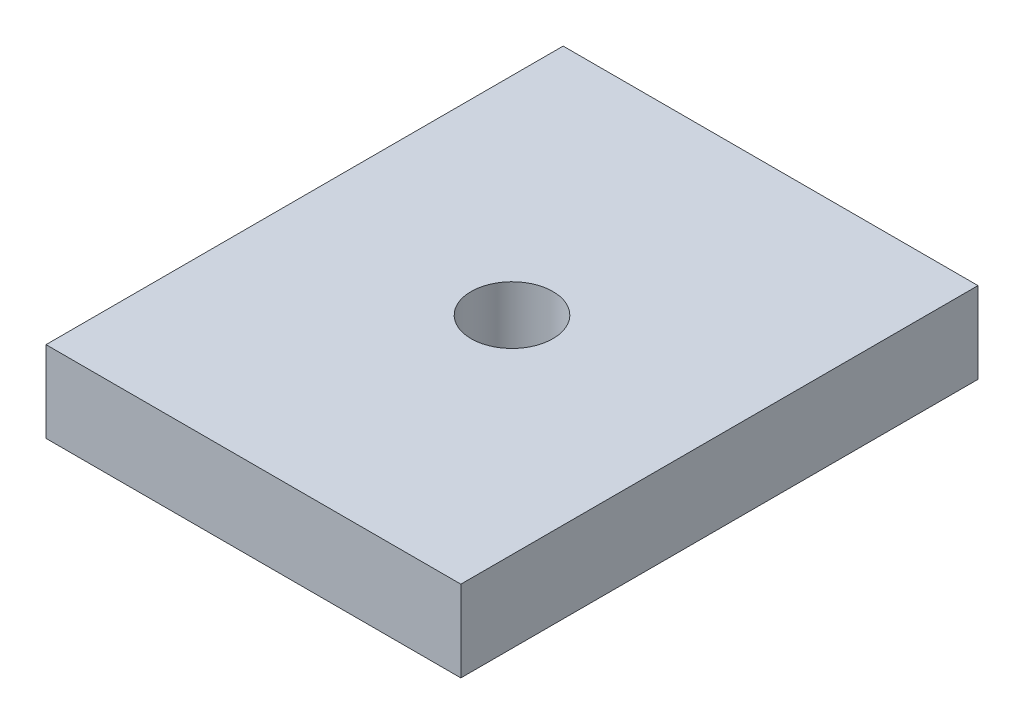
ISO-10303-21;
HEADER;
FILE_DESCRIPTION(('STEP AP214'),'2;1');
FILE_NAME('part.step','',(''),(''),'','','');
FILE_SCHEMA(('AUTOMOTIVE_DESIGN { 1 0 10303 214 1 1 1 1 }'));
ENDSEC;
DATA;
#1=APPLICATION_CONTEXT('core data for automotive mechanical design processes');
#2=APPLICATION_PROTOCOL_DEFINITION('international standard','automotive_design',2000,#1);
#3=PRODUCT_CONTEXT('',#1,'mechanical');
#4=PRODUCT('Part','Part','',(#3));
#5=PRODUCT_RELATED_PRODUCT_CATEGORY('part','',(#4));
#6=PRODUCT_DEFINITION_FORMATION('','',#4);
#7=PRODUCT_DEFINITION_CONTEXT('part definition',#1,'design');
#8=PRODUCT_DEFINITION('design','',#6,#7);
#9=PRODUCT_DEFINITION_SHAPE('','',#8);
#10=(LENGTH_UNIT() NAMED_UNIT(*) SI_UNIT(.MILLI.,.METRE.));
#11=(NAMED_UNIT(*) PLANE_ANGLE_UNIT() SI_UNIT($,.RADIAN.));
#12=(NAMED_UNIT(*) SI_UNIT($,.STERADIAN.) SOLID_ANGLE_UNIT());
#13=UNCERTAINTY_MEASURE_WITH_UNIT(LENGTH_MEASURE(1.E-05),#10,'distance_accuracy_value','');
#14=(GEOMETRIC_REPRESENTATION_CONTEXT(3) GLOBAL_UNCERTAINTY_ASSIGNED_CONTEXT((#13)) GLOBAL_UNIT_ASSIGNED_CONTEXT((#10,
#11,#12)) REPRESENTATION_CONTEXT('',''));
#15=CARTESIAN_POINT('',(0.,0.,0.));
#16=DIRECTION('',(0.,0.,1.));
#17=DIRECTION('',(1.,0.,0.));
#18=AXIS2_PLACEMENT_3D('',#15,#16,#17);
#19=CARTESIAN_POINT('',(25.537929701986,10.,31.8349129242961));
#20=DIRECTION('',(-1.,0.,0.));
#21=DIRECTION('',(0.,0.,1.));
#22=AXIS2_PLACEMENT_3D('',#19,#20,#21);
#23=PLANE('',#22);
#24=DIRECTION('',(0.,0.,-1.));
#25=VECTOR('',#24,1.);
#26=CARTESIAN_POINT('',(25.537929701986,0.,31.8349129242961));
#27=LINE('',#26,#25);
#28=CARTESIAN_POINT('',(25.537929701986,0.,31.8349129242961));
#29=VERTEX_POINT('',#28);
#30=CARTESIAN_POINT('',(25.537929701986,0.,-31.8349129242961));
#31=VERTEX_POINT('',#30);
#32=EDGE_CURVE('E102',#29,#31,#27,.T.);
#33=ORIENTED_EDGE('',*,*,#32,.T.);
#34=DIRECTION('',(0.,-1.,0.));
#35=VECTOR('',#34,1.);
#36=CARTESIAN_POINT('',(25.537929701986,10.,-31.8349129242961));
#37=LINE('',#36,#35);
#38=CARTESIAN_POINT('',(25.537929701986,10.,-31.8349129242961));
#39=VERTEX_POINT('',#38);
#40=EDGE_CURVE('E11',#39,#31,#37,.T.);
#41=ORIENTED_EDGE('',*,*,#40,.F.);
#42=DIRECTION('',(0.,0.,-1.));
#43=VECTOR('',#42,1.);
#44=CARTESIAN_POINT('',(25.537929701986,10.,31.8349129242961));
#45=LINE('',#44,#43);
#46=CARTESIAN_POINT('',(25.537929701986,10.,31.8349129242961));
#47=VERTEX_POINT('',#46);
#48=EDGE_CURVE('E90',#47,#39,#45,.T.);
#49=ORIENTED_EDGE('',*,*,#48,.F.);
#50=DIRECTION('',(0.,-1.,0.));
#51=VECTOR('',#50,1.);
#52=CARTESIAN_POINT('',(25.537929701986,10.,31.8349129242961));
#53=LINE('',#52,#51);
#54=EDGE_CURVE('E98',#47,#29,#53,.T.);
#55=ORIENTED_EDGE('',*,*,#54,.T.);
#56=EDGE_LOOP('',(#33,#41,#49,#55));
#57=FACE_BOUND('',#56,.T.);
#58=ADVANCED_FACE('F39',(#57),#23,.F.);
#59=CARTESIAN_POINT('',(-25.537929701986,10.,-31.8349129242961));
#60=DIRECTION('',(0.,0.,1.));
#61=DIRECTION('',(1.,0.,0.));
#62=AXIS2_PLACEMENT_3D('',#59,#60,#61);
#63=PLANE('',#62);
#64=DIRECTION('',(-1.,0.,0.));
#65=VECTOR('',#64,1.);
#66=CARTESIAN_POINT('',(-25.537929701986,0.,-31.8349129242961));
#67=LINE('',#66,#65);
#68=CARTESIAN_POINT('',(-25.537929701986,0.,-31.8349129242961));
#69=VERTEX_POINT('',#68);
#70=EDGE_CURVE('E94',#31,#69,#67,.T.);
#71=ORIENTED_EDGE('',*,*,#70,.T.);
#72=DIRECTION('',(0.,-1.,0.));
#73=VECTOR('',#72,1.);
#74=CARTESIAN_POINT('',(-25.537929701986,10.,-31.8349129242961));
#75=LINE('',#74,#73);
#76=CARTESIAN_POINT('',(-25.537929701986,10.,-31.8349129242961));
#77=VERTEX_POINT('',#76);
#78=EDGE_CURVE('E47',#77,#69,#75,.T.);
#79=ORIENTED_EDGE('',*,*,#78,.F.);
#80=DIRECTION('',(-1.,0.,0.));
#81=VECTOR('',#80,1.);
#82=CARTESIAN_POINT('',(-25.537929701986,10.,-31.8349129242961));
#83=LINE('',#82,#81);
#84=EDGE_CURVE('E85',#39,#77,#83,.T.);
#85=ORIENTED_EDGE('',*,*,#84,.F.);
#86=ORIENTED_EDGE('',*,*,#40,.T.);
#87=EDGE_LOOP('',(#71,#79,#85,#86));
#88=FACE_BOUND('',#87,.T.);
#89=ADVANCED_FACE('F93',(#88),#63,.F.);
#90=CARTESIAN_POINT('',(-25.537929701986,10.,31.8349129242961));
#91=DIRECTION('',(1.,0.,0.));
#92=DIRECTION('',(0.,0.,-1.));
#93=AXIS2_PLACEMENT_3D('',#90,#91,#92);
#94=PLANE('',#93);
#95=DIRECTION('',(0.,0.,1.));
#96=VECTOR('',#95,1.);
#97=CARTESIAN_POINT('',(-25.537929701986,0.,31.8349129242961));
#98=LINE('',#97,#96);
#99=CARTESIAN_POINT('',(-25.537929701986,0.,31.8349129242961));
#100=VERTEX_POINT('',#99);
#101=EDGE_CURVE('E72',#69,#100,#98,.T.);
#102=ORIENTED_EDGE('',*,*,#101,.T.);
#103=DIRECTION('',(0.,-1.,0.));
#104=VECTOR('',#103,1.);
#105=CARTESIAN_POINT('',(-25.537929701986,10.,31.8349129242961));
#106=LINE('',#105,#104);
#107=CARTESIAN_POINT('',(-25.537929701986,10.,31.8349129242961));
#108=VERTEX_POINT('',#107);
#109=EDGE_CURVE('E95',#108,#100,#106,.T.);
#110=ORIENTED_EDGE('',*,*,#109,.F.);
#111=DIRECTION('',(0.,0.,1.));
#112=VECTOR('',#111,1.);
#113=CARTESIAN_POINT('',(-25.537929701986,10.,31.8349129242961));
#114=LINE('',#113,#112);
#115=EDGE_CURVE('E88',#77,#108,#114,.T.);
#116=ORIENTED_EDGE('',*,*,#115,.F.);
#117=ORIENTED_EDGE('',*,*,#78,.T.);
#118=EDGE_LOOP('',(#102,#110,#116,#117));
#119=FACE_BOUND('',#118,.T.);
#120=ADVANCED_FACE('F96',(#119),#94,.F.);
#121=CARTESIAN_POINT('',(-25.537929701986,10.,31.8349129242961));
#122=DIRECTION('',(0.,0.,-1.));
#123=DIRECTION('',(-1.,0.,0.));
#124=AXIS2_PLACEMENT_3D('',#121,#122,#123);
#125=PLANE('',#124);
#126=DIRECTION('',(1.,0.,0.));
#127=VECTOR('',#126,1.);
#128=CARTESIAN_POINT('',(-25.537929701986,0.,31.8349129242961));
#129=LINE('',#128,#127);
#130=EDGE_CURVE('E78',#100,#29,#129,.T.);
#131=ORIENTED_EDGE('',*,*,#130,.T.);
#132=ORIENTED_EDGE('',*,*,#54,.F.);
#133=DIRECTION('',(1.,0.,0.));
#134=VECTOR('',#133,1.);
#135=CARTESIAN_POINT('',(-25.537929701986,10.,31.8349129242961));
#136=LINE('',#135,#134);
#137=EDGE_CURVE('E55',#108,#47,#136,.T.);
#138=ORIENTED_EDGE('',*,*,#137,.F.);
#139=ORIENTED_EDGE('',*,*,#109,.T.);
#140=EDGE_LOOP('',(#131,#132,#138,#139));
#141=FACE_BOUND('',#140,.T.);
#142=ADVANCED_FACE('F110',(#141),#125,.F.);
#143=CARTESIAN_POINT('',(0.,10.,0.));
#144=DIRECTION('',(0.,-1.,0.));
#145=DIRECTION('',(0.,0.,-1.));
#146=AXIS2_PLACEMENT_3D('',#143,#144,#145);
#147=PLANE('',#146);
#148=CARTESIAN_POINT('',(0.,10.,0.));
#149=DIRECTION('',(0.,1.,0.));
#150=DIRECTION('',(0.,0.,1.));
#151=AXIS2_PLACEMENT_3D('',#148,#149,#150);
#152=CIRCLE('',#151,5.03656922970219);
#153=CARTESIAN_POINT('',(0.,10.,5.03656922970219));
#154=VERTEX_POINT('',#153);
#155=EDGE_CURVE('E116',#154,#154,#152,.T.);
#156=ORIENTED_EDGE('',*,*,#155,.F.);
#157=EDGE_LOOP('',(#156));
#158=FACE_BOUND('',#157,.T.);
#159=ORIENTED_EDGE('',*,*,#48,.T.);
#160=ORIENTED_EDGE('',*,*,#84,.T.);
#161=ORIENTED_EDGE('',*,*,#115,.T.);
#162=ORIENTED_EDGE('',*,*,#137,.T.);
#163=EDGE_LOOP('',(#159,#160,#161,#162));
#164=FACE_BOUND('',#163,.T.);
#165=ADVANCED_FACE('F86',(#158,#164),#147,.F.);
#166=CARTESIAN_POINT('',(0.,0.,0.));
#167=DIRECTION('',(0.,-1.,0.));
#168=DIRECTION('',(0.,0.,-1.));
#169=AXIS2_PLACEMENT_3D('',#166,#167,#168);
#170=PLANE('',#169);
#171=CARTESIAN_POINT('',(0.,0.,0.));
#172=DIRECTION('',(0.,1.,0.));
#173=DIRECTION('',(0.,0.,1.));
#174=AXIS2_PLACEMENT_3D('',#171,#172,#173);
#175=CIRCLE('',#174,5.03656922970219);
#176=CARTESIAN_POINT('',(0.,0.,5.03656922970219));
#177=VERTEX_POINT('',#176);
#178=EDGE_CURVE('E105',#177,#177,#175,.T.);
#179=ORIENTED_EDGE('',*,*,#178,.T.);
#180=EDGE_LOOP('',(#179));
#181=FACE_BOUND('',#180,.T.);
#182=ORIENTED_EDGE('',*,*,#32,.F.);
#183=ORIENTED_EDGE('',*,*,#130,.F.);
#184=ORIENTED_EDGE('',*,*,#101,.F.);
#185=ORIENTED_EDGE('',*,*,#70,.F.);
#186=EDGE_LOOP('',(#182,#183,#184,#185));
#187=FACE_BOUND('',#186,.T.);
#188=ADVANCED_FACE('F113',(#181,#187),#170,.T.);
#189=CARTESIAN_POINT('',(0.,0.,0.));
#190=DIRECTION('',(0.,1.,0.));
#191=DIRECTION('',(0.,0.,1.));
#192=AXIS2_PLACEMENT_3D('',#189,#190,#191);
#193=CYLINDRICAL_SURFACE('',#192,5.03656922970219);
#194=ORIENTED_EDGE('',*,*,#178,.F.);
#195=EDGE_LOOP('',(#194));
#196=FACE_BOUND('',#195,.T.);
#197=ORIENTED_EDGE('',*,*,#155,.T.);
#198=EDGE_LOOP('',(#197));
#199=FACE_BOUND('',#198,.T.);
#200=ADVANCED_FACE('F123',(#196,#199),#193,.F.);
#201=CLOSED_SHELL('',(#58,#89,#120,#142,#165,#188,#200));
#202=MANIFOLD_SOLID_BREP('B2',#201);
#203=ADVANCED_BREP_SHAPE_REPRESENTATION('',(#18,#202),#14);
#204=SHAPE_DEFINITION_REPRESENTATION(#9,#203);
ENDSEC;
END-ISO-10303-21;
